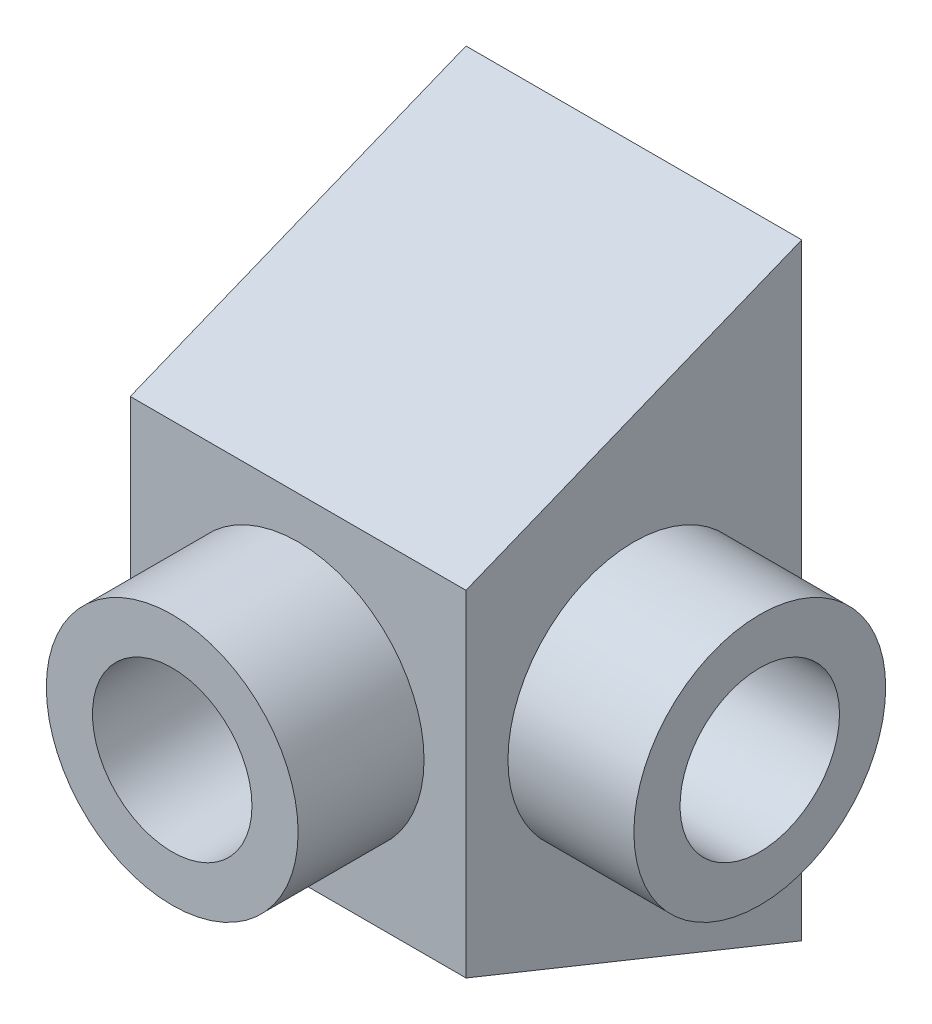
ISO-10303-21;
HEADER;
FILE_DESCRIPTION(('STEP AP214'),'2;1');
FILE_NAME('part.step','',(''),(''),'','','');
FILE_SCHEMA(('AUTOMOTIVE_DESIGN { 1 0 10303 214 1 1 1 1 }'));
ENDSEC;
DATA;
#1=APPLICATION_CONTEXT('core data for automotive mechanical design processes');
#2=APPLICATION_PROTOCOL_DEFINITION('international standard','automotive_design',2000,#1);
#3=PRODUCT_CONTEXT('',#1,'mechanical');
#4=PRODUCT('Part','Part','',(#3));
#5=PRODUCT_RELATED_PRODUCT_CATEGORY('part','',(#4));
#6=PRODUCT_DEFINITION_FORMATION('','',#4);
#7=PRODUCT_DEFINITION_CONTEXT('part definition',#1,'design');
#8=PRODUCT_DEFINITION('design','',#6,#7);
#9=PRODUCT_DEFINITION_SHAPE('','',#8);
#10=(LENGTH_UNIT() NAMED_UNIT(*) SI_UNIT(.MILLI.,.METRE.));
#11=(NAMED_UNIT(*) PLANE_ANGLE_UNIT() SI_UNIT($,.RADIAN.));
#12=(NAMED_UNIT(*) SI_UNIT($,.STERADIAN.) SOLID_ANGLE_UNIT());
#13=UNCERTAINTY_MEASURE_WITH_UNIT(LENGTH_MEASURE(1.E-05),#10,'distance_accuracy_value','');
#14=(GEOMETRIC_REPRESENTATION_CONTEXT(3) GLOBAL_UNCERTAINTY_ASSIGNED_CONTEXT((#13)) GLOBAL_UNIT_ASSIGNED_CONTEXT((#10,
#11,#12)) REPRESENTATION_CONTEXT('',''));
#15=CARTESIAN_POINT('',(0.,0.,0.));
#16=DIRECTION('',(0.,0.,1.));
#17=DIRECTION('',(1.,0.,0.));
#18=AXIS2_PLACEMENT_3D('',#15,#16,#17);
#19=CARTESIAN_POINT('',(0.,0.,30.));
#20=DIRECTION('',(0.,0.,1.));
#21=DIRECTION('',(1.,0.,0.));
#22=AXIS2_PLACEMENT_3D('',#19,#20,#21);
#23=PLANE('',#22);
#24=CARTESIAN_POINT('',(0.,0.,30.));
#25=DIRECTION('',(0.,0.,1.));
#26=DIRECTION('',(1.,0.,0.));
#27=AXIS2_PLACEMENT_3D('',#24,#25,#26);
#28=CIRCLE('',#27,30.);
#29=CARTESIAN_POINT('',(30.,0.,30.));
#30=VERTEX_POINT('',#29);
#31=EDGE_CURVE('E42',#30,#30,#28,.T.);
#32=ORIENTED_EDGE('',*,*,#31,.T.);
#33=EDGE_LOOP('',(#32));
#34=FACE_BOUND('',#33,.T.);
#35=CARTESIAN_POINT('',(0.,0.,30.));
#36=DIRECTION('',(0.,0.,1.));
#37=DIRECTION('',(1.,0.,0.));
#38=AXIS2_PLACEMENT_3D('',#35,#36,#37);
#39=CIRCLE('',#38,19.);
#40=CARTESIAN_POINT('',(19.,0.,30.));
#41=VERTEX_POINT('',#40);
#42=EDGE_CURVE('E123',#41,#41,#39,.T.);
#43=ORIENTED_EDGE('',*,*,#42,.F.);
#44=EDGE_LOOP('',(#43));
#45=FACE_BOUND('',#44,.T.);
#46=ADVANCED_FACE('F34',(#34,#45),#23,.T.);
#47=CARTESIAN_POINT('',(0.,0.,30.));
#48=DIRECTION('',(0.,0.,-1.));
#49=DIRECTION('',(-1.,0.,0.));
#50=AXIS2_PLACEMENT_3D('',#47,#48,#49);
#51=CYLINDRICAL_SURFACE('',#50,30.);
#52=ORIENTED_EDGE('',*,*,#31,.F.);
#53=EDGE_LOOP('',(#52));
#54=FACE_BOUND('',#53,.T.);
#55=CARTESIAN_POINT('',(0.,0.,0.));
#56=DIRECTION('',(0.,0.,-1.));
#57=DIRECTION('',(-1.,0.,0.));
#58=AXIS2_PLACEMENT_3D('',#55,#56,#57);
#59=CIRCLE('',#58,30.);
#60=CARTESIAN_POINT('',(-30.,0.,0.));
#61=VERTEX_POINT('',#60);
#62=EDGE_CURVE('E84',#61,#61,#59,.T.);
#63=ORIENTED_EDGE('',*,*,#62,.F.);
#64=EDGE_LOOP('',(#63));
#65=FACE_BOUND('',#64,.T.);
#66=ADVANCED_FACE('F36',(#54,#65),#51,.T.);
#67=CARTESIAN_POINT('',(0.,0.,30.));
#68=DIRECTION('',(0.,0.,-1.));
#69=DIRECTION('',(-1.,0.,0.));
#70=AXIS2_PLACEMENT_3D('',#67,#68,#69);
#71=CYLINDRICAL_SURFACE('',#70,19.);
#72=ORIENTED_EDGE('',*,*,#42,.T.);
#73=EDGE_LOOP('',(#72));
#74=FACE_BOUND('',#73,.T.);
#75=CARTESIAN_POINT('',(0.,0.,0.));
#76=DIRECTION('',(0.,0.,1.));
#77=DIRECTION('',(1.,0.,0.));
#78=AXIS2_PLACEMENT_3D('',#75,#76,#77);
#79=CIRCLE('',#78,19.);
#80=CARTESIAN_POINT('',(19.,0.,0.));
#81=VERTEX_POINT('',#80);
#82=EDGE_CURVE('E122',#81,#81,#79,.T.);
#83=ORIENTED_EDGE('',*,*,#82,.F.);
#84=EDGE_LOOP('',(#83));
#85=FACE_BOUND('',#84,.T.);
#86=ADVANCED_FACE('F134',(#74,#85),#71,.F.);
#87=CARTESIAN_POINT('',(0.,0.,0.));
#88=DIRECTION('',(0.,0.,-1.));
#89=DIRECTION('',(-1.,0.,0.));
#90=AXIS2_PLACEMENT_3D('',#87,#88,#89);
#91=PLANE('',#90);
#92=ORIENTED_EDGE('',*,*,#82,.T.);
#93=EDGE_LOOP('',(#92));
#94=FACE_BOUND('',#93,.T.);
#95=ADVANCED_FACE('F141',(#94),#91,.F.);
#96=CARTESIAN_POINT('',(-40.,40.,-80.));
#97=DIRECTION('',(-1.,0.,0.));
#98=DIRECTION('',(0.,0.,1.));
#99=AXIS2_PLACEMENT_3D('',#96,#97,#98);
#100=PLANE('',#99);
#101=DIRECTION('',(0.,-1.,0.));
#102=VECTOR('',#101,1.);
#103=CARTESIAN_POINT('',(-40.,40.,0.));
#104=LINE('',#103,#102);
#105=CARTESIAN_POINT('',(-40.,40.,0.));
#106=VERTEX_POINT('',#105);
#107=CARTESIAN_POINT('',(-40.,-40.,0.));
#108=VERTEX_POINT('',#107);
#109=EDGE_CURVE('E54',#106,#108,#104,.T.);
#110=ORIENTED_EDGE('',*,*,#109,.F.);
#111=DIRECTION('',(0.,-0.374585689250058,0.927192300123906));
#112=VECTOR('',#111,1.);
#113=CARTESIAN_POINT('',(-40.,72.32,-80.));
#114=LINE('',#113,#112);
#115=CARTESIAN_POINT('',(-40.,72.32,-80.));
#116=VERTEX_POINT('',#115);
#117=EDGE_CURVE('E95',#116,#106,#114,.T.);
#118=ORIENTED_EDGE('',*,*,#117,.F.);
#119=DIRECTION('',(0.,-1.,0.));
#120=VECTOR('',#119,1.);
#121=CARTESIAN_POINT('',(-40.,40.,-80.));
#122=LINE('',#121,#120);
#123=CARTESIAN_POINT('',(-40.,-72.32,-80.));
#124=VERTEX_POINT('',#123);
#125=EDGE_CURVE('E85',#116,#124,#122,.T.);
#126=ORIENTED_EDGE('',*,*,#125,.T.);
#127=DIRECTION('',(0.,-0.374585689250058,-0.927192300123906));
#128=VECTOR('',#127,1.);
#129=CARTESIAN_POINT('',(-40.,-72.32,-80.));
#130=LINE('',#129,#128);
#131=EDGE_CURVE('E91',#108,#124,#130,.T.);
#132=ORIENTED_EDGE('',*,*,#131,.F.);
#133=EDGE_LOOP('',(#110,#118,#126,#132));
#134=FACE_BOUND('',#133,.T.);
#135=ADVANCED_FACE('F152',(#134),#100,.T.);
#136=CARTESIAN_POINT('',(40.,40.,-80.));
#137=DIRECTION('',(1.,0.,0.));
#138=DIRECTION('',(0.,1.,0.));
#139=AXIS2_PLACEMENT_3D('',#136,#137,#138);
#140=PLANE('',#139);
#141=CARTESIAN_POINT('',(40.,0.,-40.));
#142=DIRECTION('',(1.,0.,0.));
#143=DIRECTION('',(0.,0.,-1.));
#144=AXIS2_PLACEMENT_3D('',#141,#142,#143);
#145=CIRCLE('',#144,30.);
#146=CARTESIAN_POINT('',(40.,0.,-70.));
#147=VERTEX_POINT('',#146);
#148=EDGE_CURVE('E107',#147,#147,#145,.T.);
#149=ORIENTED_EDGE('',*,*,#148,.F.);
#150=EDGE_LOOP('',(#149));
#151=FACE_BOUND('',#150,.T.);
#152=DIRECTION('',(0.,1.,0.));
#153=VECTOR('',#152,1.);
#154=CARTESIAN_POINT('',(40.,40.,0.));
#155=LINE('',#154,#153);
#156=CARTESIAN_POINT('',(40.,-40.,0.));
#157=VERTEX_POINT('',#156);
#158=CARTESIAN_POINT('',(40.,40.,0.));
#159=VERTEX_POINT('',#158);
#160=EDGE_CURVE('E49',#157,#159,#155,.T.);
#161=ORIENTED_EDGE('',*,*,#160,.F.);
#162=DIRECTION('',(0.,-0.374585689250058,-0.927192300123906));
#163=VECTOR('',#162,1.);
#164=CARTESIAN_POINT('',(40.,-72.32,-80.));
#165=LINE('',#164,#163);
#166=CARTESIAN_POINT('',(40.,-72.32,-80.));
#167=VERTEX_POINT('',#166);
#168=EDGE_CURVE('E88',#157,#167,#165,.T.);
#169=ORIENTED_EDGE('',*,*,#168,.T.);
#170=DIRECTION('',(0.,1.,0.));
#171=VECTOR('',#170,1.);
#172=CARTESIAN_POINT('',(40.,40.,-80.));
#173=LINE('',#172,#171);
#174=CARTESIAN_POINT('',(40.,72.32,-80.));
#175=VERTEX_POINT('',#174);
#176=EDGE_CURVE('E74',#167,#175,#173,.T.);
#177=ORIENTED_EDGE('',*,*,#176,.T.);
#178=DIRECTION('',(0.,-0.374585689250058,0.927192300123906));
#179=VECTOR('',#178,1.);
#180=CARTESIAN_POINT('',(40.,72.32,-80.));
#181=LINE('',#180,#179);
#182=EDGE_CURVE('E98',#175,#159,#181,.T.);
#183=ORIENTED_EDGE('',*,*,#182,.T.);
#184=EDGE_LOOP('',(#161,#169,#177,#183));
#185=FACE_BOUND('',#184,.T.);
#186=ADVANCED_FACE('F89',(#151,#185),#140,.T.);
#187=CARTESIAN_POINT('',(0.,0.,-80.));
#188=DIRECTION('',(0.,0.,-1.));
#189=DIRECTION('',(-1.,0.,0.));
#190=AXIS2_PLACEMENT_3D('',#187,#188,#189);
#191=PLANE('',#190);
#192=ORIENTED_EDGE('',*,*,#125,.F.);
#193=DIRECTION('',(-1.,0.,0.));
#194=VECTOR('',#193,1.);
#195=CARTESIAN_POINT('',(40.,72.32,-80.));
#196=LINE('',#195,#194);
#197=EDGE_CURVE('E81',#175,#116,#196,.T.);
#198=ORIENTED_EDGE('',*,*,#197,.F.);
#199=ORIENTED_EDGE('',*,*,#176,.F.);
#200=DIRECTION('',(-1.,0.,0.));
#201=VECTOR('',#200,1.);
#202=CARTESIAN_POINT('',(40.,-72.32,-80.));
#203=LINE('',#202,#201);
#204=EDGE_CURVE('E78',#167,#124,#203,.T.);
#205=ORIENTED_EDGE('',*,*,#204,.T.);
#206=EDGE_LOOP('',(#192,#198,#199,#205));
#207=FACE_BOUND('',#206,.T.);
#208=ADVANCED_FACE('F76',(#207),#191,.T.);
#209=ORIENTED_EDGE('',*,*,#62,.T.);
#210=EDGE_LOOP('',(#209));
#211=FACE_BOUND('',#210,.T.);
#212=ORIENTED_EDGE('',*,*,#109,.T.);
#213=DIRECTION('',(1.,0.,0.));
#214=VECTOR('',#213,1.);
#215=CARTESIAN_POINT('',(40.,-40.,0.));
#216=LINE('',#215,#214);
#217=EDGE_CURVE('E116',#108,#157,#216,.T.);
#218=ORIENTED_EDGE('',*,*,#217,.T.);
#219=ORIENTED_EDGE('',*,*,#160,.T.);
#220=DIRECTION('',(-1.,0.,0.));
#221=VECTOR('',#220,1.);
#222=CARTESIAN_POINT('',(40.,40.,0.));
#223=LINE('',#222,#221);
#224=EDGE_CURVE('E113',#159,#106,#223,.T.);
#225=ORIENTED_EDGE('',*,*,#224,.T.);
#226=EDGE_LOOP('',(#212,#218,#219,#225));
#227=FACE_BOUND('',#226,.T.);
#228=ADVANCED_FACE('F137',(#211,#227),#91,.F.);
#229=CARTESIAN_POINT('',(70.,0.,-40.));
#230=DIRECTION('',(1.,0.,0.));
#231=DIRECTION('',(0.,0.,-1.));
#232=AXIS2_PLACEMENT_3D('',#229,#230,#231);
#233=PLANE('',#232);
#234=CARTESIAN_POINT('',(70.,0.,-40.));
#235=DIRECTION('',(1.,0.,0.));
#236=DIRECTION('',(0.,0.,-1.));
#237=AXIS2_PLACEMENT_3D('',#234,#235,#236);
#238=CIRCLE('',#237,30.);
#239=CARTESIAN_POINT('',(70.,0.,-70.));
#240=VERTEX_POINT('',#239);
#241=EDGE_CURVE('E108',#240,#240,#238,.T.);
#242=ORIENTED_EDGE('',*,*,#241,.T.);
#243=EDGE_LOOP('',(#242));
#244=FACE_BOUND('',#243,.T.);
#245=CARTESIAN_POINT('',(70.,0.,-40.));
#246=DIRECTION('',(1.,0.,0.));
#247=DIRECTION('',(0.,0.,-1.));
#248=AXIS2_PLACEMENT_3D('',#245,#246,#247);
#249=CIRCLE('',#248,19.);
#250=CARTESIAN_POINT('',(70.,0.,-59.));
#251=VERTEX_POINT('',#250);
#252=EDGE_CURVE('E104',#251,#251,#249,.T.);
#253=ORIENTED_EDGE('',*,*,#252,.F.);
#254=EDGE_LOOP('',(#253));
#255=FACE_BOUND('',#254,.T.);
#256=ADVANCED_FACE('F139',(#244,#255),#233,.T.);
#257=CARTESIAN_POINT('',(70.,0.,-40.));
#258=DIRECTION('',(-1.,0.,0.));
#259=DIRECTION('',(0.,0.,1.));
#260=AXIS2_PLACEMENT_3D('',#257,#258,#259);
#261=CYLINDRICAL_SURFACE('',#260,30.);
#262=ORIENTED_EDGE('',*,*,#241,.F.);
#263=EDGE_LOOP('',(#262));
#264=FACE_BOUND('',#263,.T.);
#265=ORIENTED_EDGE('',*,*,#148,.T.);
#266=EDGE_LOOP('',(#265));
#267=FACE_BOUND('',#266,.T.);
#268=ADVANCED_FACE('F146',(#264,#267),#261,.T.);
#269=CARTESIAN_POINT('',(70.,0.,-40.));
#270=DIRECTION('',(-1.,0.,0.));
#271=DIRECTION('',(0.,0.,1.));
#272=AXIS2_PLACEMENT_3D('',#269,#270,#271);
#273=CYLINDRICAL_SURFACE('',#272,19.);
#274=ORIENTED_EDGE('',*,*,#252,.T.);
#275=EDGE_LOOP('',(#274));
#276=FACE_BOUND('',#275,.T.);
#277=CARTESIAN_POINT('',(40.,0.,-40.));
#278=DIRECTION('',(1.,0.,0.));
#279=DIRECTION('',(0.,1.,0.));
#280=AXIS2_PLACEMENT_3D('',#277,#278,#279);
#281=CIRCLE('',#280,19.);
#282=CARTESIAN_POINT('',(40.,19.,-40.));
#283=VERTEX_POINT('',#282);
#284=EDGE_CURVE('E11',#283,#283,#281,.F.);
#285=ORIENTED_EDGE('',*,*,#284,.T.);
#286=EDGE_LOOP('',(#285));
#287=FACE_BOUND('',#286,.T.);
#288=ADVANCED_FACE('F171',(#276,#287),#273,.F.);
#289=ORIENTED_EDGE('',*,*,#284,.F.);
#290=EDGE_LOOP('',(#289));
#291=FACE_BOUND('',#290,.T.);
#292=ADVANCED_FACE('F165',(#291),#140,.T.);
#293=CARTESIAN_POINT('',(40.,72.32,-80.));
#294=DIRECTION('',(0.,-0.927192300123906,-0.374585689250058));
#295=DIRECTION('',(0.,0.374585689250058,-0.927192300123906));
#296=AXIS2_PLACEMENT_3D('',#293,#294,#295);
#297=PLANE('',#296);
#298=ORIENTED_EDGE('',*,*,#117,.T.);
#299=ORIENTED_EDGE('',*,*,#224,.F.);
#300=ORIENTED_EDGE('',*,*,#182,.F.);
#301=ORIENTED_EDGE('',*,*,#197,.T.);
#302=EDGE_LOOP('',(#298,#299,#300,#301));
#303=FACE_BOUND('',#302,.T.);
#304=ADVANCED_FACE('F170',(#303),#297,.F.);
#305=CARTESIAN_POINT('',(40.,-72.32,-80.));
#306=DIRECTION('',(0.,0.927192300123906,-0.374585689250058));
#307=DIRECTION('',(0.,0.374585689250058,0.927192300123906));
#308=AXIS2_PLACEMENT_3D('',#305,#306,#307);
#309=PLANE('',#308);
#310=ORIENTED_EDGE('',*,*,#131,.T.);
#311=ORIENTED_EDGE('',*,*,#204,.F.);
#312=ORIENTED_EDGE('',*,*,#168,.F.);
#313=ORIENTED_EDGE('',*,*,#217,.F.);
#314=EDGE_LOOP('',(#310,#311,#312,#313));
#315=FACE_BOUND('',#314,.T.);
#316=ADVANCED_FACE('F93',(#315),#309,.F.);
#317=CLOSED_SHELL('',(#46,#66,#86,#95,#135,#186,#208,#228,#256,#268,#288,#292,#304,#316));
#318=MANIFOLD_SOLID_BREP('B2',#317);
#319=ADVANCED_BREP_SHAPE_REPRESENTATION('',(#18,#318),#14);
#320=SHAPE_DEFINITION_REPRESENTATION(#9,#319);
ENDSEC;
END-ISO-10303-21;
